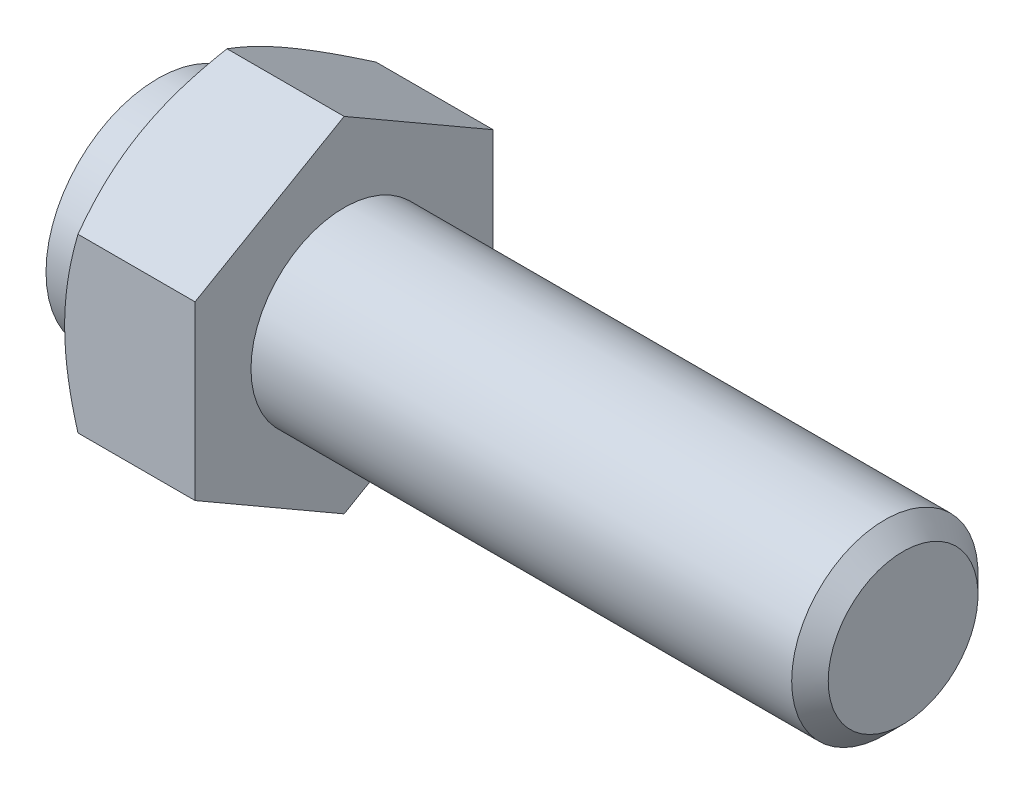
ISO-10303-21;
HEADER;
FILE_DESCRIPTION(('STEP AP214'),'2;1');
FILE_NAME('part.step','',(''),(''),'','','');
FILE_SCHEMA(('AUTOMOTIVE_DESIGN { 1 0 10303 214 1 1 1 1 }'));
ENDSEC;
DATA;
#1=APPLICATION_CONTEXT('core data for automotive mechanical design processes');
#2=APPLICATION_PROTOCOL_DEFINITION('international standard','automotive_design',2000,#1);
#3=PRODUCT_CONTEXT('',#1,'mechanical');
#4=PRODUCT('Part','Part','',(#3));
#5=PRODUCT_RELATED_PRODUCT_CATEGORY('part','',(#4));
#6=PRODUCT_DEFINITION_FORMATION('','',#4);
#7=PRODUCT_DEFINITION_CONTEXT('part definition',#1,'design');
#8=PRODUCT_DEFINITION('design','',#6,#7);
#9=PRODUCT_DEFINITION_SHAPE('','',#8);
#10=(LENGTH_UNIT() NAMED_UNIT(*) SI_UNIT(.MILLI.,.METRE.));
#11=(NAMED_UNIT(*) PLANE_ANGLE_UNIT() SI_UNIT($,.RADIAN.));
#12=(NAMED_UNIT(*) SI_UNIT($,.STERADIAN.) SOLID_ANGLE_UNIT());
#13=UNCERTAINTY_MEASURE_WITH_UNIT(LENGTH_MEASURE(1.E-05),#10,'distance_accuracy_value','');
#14=(GEOMETRIC_REPRESENTATION_CONTEXT(3) GLOBAL_UNCERTAINTY_ASSIGNED_CONTEXT((#13)) GLOBAL_UNIT_ASSIGNED_CONTEXT((#10,
#11,#12)) REPRESENTATION_CONTEXT('',''));
#15=CARTESIAN_POINT('',(0.,0.,0.));
#16=DIRECTION('',(0.,0.,1.));
#17=DIRECTION('',(1.,0.,0.));
#18=AXIS2_PLACEMENT_3D('',#15,#16,#17);
#19=CARTESIAN_POINT('',(-3.0381197846483,0.,0.));
#20=DIRECTION('',(1.,0.,0.));
#21=DIRECTION('',(0.,0.,-1.));
#22=AXIS2_PLACEMENT_3D('',#19,#20,#21);
#23=CONICAL_SURFACE('',#22,4.8,1.0471975511966);
#24=CARTESIAN_POINT('',(-1.57887075856019,-6.13939413294062,-4.));
#25=CARTESIAN_POINT('',(-1.66310456135239,-5.96521405575991,-4.));
#26=CARTESIAN_POINT('',(-1.74651196722151,-5.79062719131365,-4.));
#27=CARTESIAN_POINT('',(-1.91120786296767,-5.4404233088383,-4.));
#28=CARTESIAN_POINT('',(-1.99249600566286,-5.26480612772211,-4.));
#29=CARTESIAN_POINT('',(-2.15291001647984,-4.91138909620253,-4.));
#30=CARTESIAN_POINT('',(-2.23202112648227,-4.73358252336361,-4.));
#31=CARTESIAN_POINT('',(-2.38691919338498,-4.37653257309947,-4.));
#32=CARTESIAN_POINT('',(-2.4627063118463,-4.19728926600801,-4.));
#33=CARTESIAN_POINT('',(-2.61234069122834,-3.83154690304012,-4.));
#34=CARTESIAN_POINT('',(-2.68605704395079,-3.64499398861433,-4.));
#35=CARTESIAN_POINT('',(-2.82775411783598,-3.26968207246464,-4.));
#36=CARTESIAN_POINT('',(-2.89573418644737,-3.08092282252454,-4.));
#37=CARTESIAN_POINT('',(-3.02412704969833,-2.70127250879012,-4.));
#38=CARTESIAN_POINT('',(-3.08455573470301,-2.51038687463865,-4.));
#39=CARTESIAN_POINT('',(-3.19586469424676,-2.12587868357917,-4.));
#40=CARTESIAN_POINT('',(-3.24674804503767,-1.9322570301368,-4.));
#41=CARTESIAN_POINT('',(-3.33621571413744,-1.54322946382705,-4.));
#42=CARTESIAN_POINT('',(-3.37486428853927,-1.34783861004955,-4.));
#43=CARTESIAN_POINT('',(-3.43763422340833,-0.954695670395886,-4.));
#44=CARTESIAN_POINT('',(-3.46175683200502,-0.756943788878232,-4.));
#45=CARTESIAN_POINT('',(-3.49323359916261,-0.362621629692278,-4.));
#46=CARTESIAN_POINT('',(-3.50079822453623,-0.166068575033683,-4.));
#47=CARTESIAN_POINT('',(-3.49906790973023,0.22697710282604,-4.));
#48=CARTESIAN_POINT('',(-3.48977250832793,0.423469724226885,-4.));
#49=CARTESIAN_POINT('',(-3.4601531531514,0.758990273736847,-4.));
#50=CARTESIAN_POINT('',(-3.4437429725596,0.898383211053861,-4.));
#51=CARTESIAN_POINT('',(-3.40349476320339,1.17610009207901,-4.));
#52=CARTESIAN_POINT('',(-3.37965566898105,1.31442387953114,-4.));
#53=CARTESIAN_POINT('',(-3.29825326079294,1.72763495504876,-4.));
#54=CARTESIAN_POINT('',(-3.23082125051095,2.00059716271886,-4.));
#55=CARTESIAN_POINT('',(-3.11451374843233,2.4086618777131,-4.));
#56=CARTESIAN_POINT('',(-3.07269287237421,2.54589494973044,-4.));
#57=CARTESIAN_POINT('',(-2.98486276665558,2.81902707997843,-4.));
#58=CARTESIAN_POINT('',(-2.93885351028713,2.95492612969632,-4.));
#59=CARTESIAN_POINT('',(-2.8433720179148,3.22543632873522,-4.));
#60=CARTESIAN_POINT('',(-2.79390102621892,3.36004792125238,-4.));
#61=CARTESIAN_POINT('',(-2.69206223773492,3.62816633823099,-4.));
#62=CARTESIAN_POINT('',(-2.63969446772329,3.7616731728912,-4.));
#63=CARTESIAN_POINT('',(-2.51762334906241,4.06475987665195,-4.));
#64=CARTESIAN_POINT('',(-2.447153932986,4.23403057744389,-4.));
#65=CARTESIAN_POINT('',(-2.30305911863712,4.57122630399107,-4.));
#66=CARTESIAN_POINT('',(-2.2294335680974,4.73915126435632,-4.));
#67=CARTESIAN_POINT('',(-2.00475288292282,5.24128493973562,-4.));
#68=CARTESIAN_POINT('',(-1.84991548479837,5.57379958004737,-4.));
#69=CARTESIAN_POINT('',(-1.53341711594573,6.23589456855972,-4.));
#70=CARTESIAN_POINT('',(-1.37175021882607,6.56547205474275,-4.));
#71=CARTESIAN_POINT('',(-1.04374298683518,7.22230103495159,-4.));
#72=CARTESIAN_POINT('',(-0.877402497289287,7.54955245154491,-4.));
#73=CARTESIAN_POINT('',(-0.554464691453707,8.17689265348602,-4.));
#74=CARTESIAN_POINT('',(-0.398118172737164,8.47711096920773,-4.));
#75=CARTESIAN_POINT('',(-0.0832622099771653,9.07642118538344,-4.));
#76=CARTESIAN_POINT('',(0.0752472970322463,9.37551305272103,-4.));
#77=CARTESIAN_POINT('',(0.393577197351747,9.97215228024386,-4.));
#78=CARTESIAN_POINT('',(0.553393940840381,10.2697015905905,-4.));
#79=CARTESIAN_POINT('',(0.874341146801538,10.8640723738865,-4.));
#80=CARTESIAN_POINT('',(1.035471544643,11.1608938817197,-4.));
#81=CARTESIAN_POINT('',(1.19709645417552,11.4574439973737,-4.));
#82=B_SPLINE_CURVE_WITH_KNOTS('',3,(#24,#25,#26,#27,#28,#29,#30,#31,#32,#33,#34,#35,#36,#37,#38,
#39,#40,#41,#42,#43,#44,#45,#46,#47,#48,#49,#50,#51,#52,#53,#54,#55,#56,#57,#58,#59,#60,#61,#62,
#63,#64,#65,#66,#67,#68,#69,#70,#71,#72,#73,#74,#75,#76,#77,#78,#79,#80,#81),.UNSPECIFIED.,.F.,
.F.,(4,2,2,2,2,2,2,2,2,2,2,2,2,2,2,2,2,2,2,2,2,2,2,2,2,2,2,2,4),(0.,0.580443710282804,
1.16098191997214,1.74479005581554,2.32856978442474,2.93026499507168,3.5320285616732,
4.13250371575107,4.73278501614091,5.32985927078346,5.92688221507965,6.51627129067315,
7.10567648982992,7.52653774537938,7.94745938882889,8.78979727003888,9.22015473586381,
9.6505149461308,10.0807212518396,10.5109235815821,11.0609419553601,11.610986894627,
12.7112482185919,13.8124847525738,14.9137577755076,15.9292165443316,16.9447049371326,
17.957959920125,18.9711653488122),.UNSPECIFIED.);
#83=CARTESIAN_POINT('',(-3.14273441009184,-2.3094010767585,-4.));
#84=VERTEX_POINT('',#83);
#85=CARTESIAN_POINT('',(-3.5,0.,-4.));
#86=VERTEX_POINT('',#85);
#87=EDGE_CURVE('E203',#84,#86,#82,.T.);
#88=ORIENTED_EDGE('',*,*,#87,.F.);
#89=CARTESIAN_POINT('',(-3.14266774092523,-4.61891762357084,0.000200000000000067));
#90=CARTESIAN_POINT('',(-3.20128212635172,-4.5174314838138,-0.175579150323228));
#91=CARTESIAN_POINT('',(-3.25458967853774,-4.41506932144052,-0.35287561632638));
#92=CARTESIAN_POINT('',(-3.3476383292536,-4.20857250547739,-0.710538593175706));
#93=CARTESIAN_POINT('',(-3.3873465109703,-4.10443418285647,-0.89091145897015));
#94=CARTESIAN_POINT('',(-3.44915778471972,-3.89744813015756,-1.24942181870279));
#95=CARTESIAN_POINT('',(-3.47167226847711,-3.79463224655059,-1.42750415293514));
#96=CARTESIAN_POINT('',(-3.49854937685342,-3.58851671999023,-1.78450671716651));
#97=CARTESIAN_POINT('',(-3.50293425857306,-3.48521782616117,-1.9634256496441));
#98=CARTESIAN_POINT('',(-3.49380992706003,-3.29219970504619,-2.29774284219673));
#99=CARTESIAN_POINT('',(-3.48254104601201,-3.20245157692486,-2.45319115998707));
#100=CARTESIAN_POINT('',(-3.44682600920181,-3.02354002635497,-2.76307505563505));
#101=CARTESIAN_POINT('',(-3.42236765428847,-2.93437722268073,-2.91750956174413));
#102=CARTESIAN_POINT('',(-3.36122393508071,-2.75509682012354,-3.22803232777458));
#103=CARTESIAN_POINT('',(-3.32427939634514,-2.6650019108942,-3.3840812880631));
#104=CARTESIAN_POINT('',(-3.24042992745198,-2.48615580200001,-3.69385183540384));
#105=CARTESIAN_POINT('',(-3.19354469778726,-2.39740231122585,-3.84757739077378));
#106=CARTESIAN_POINT('',(-3.14266774092524,-2.30928560670467,-4.0002));
#107=B_SPLINE_CURVE_WITH_KNOTS('',3,(#89,#90,#91,#92,#93,#94,#95,#96,#97,#98,#99,#100,#101,#102,
#103,#104,#105,#106),.UNSPECIFIED.,.F.,.F.,(4,2,2,2,2,2,2,2,4),(0.,0.634047835695965,
1.26961969224543,1.88946157213122,2.50854226669297,3.04757825393386,3.58711366126903,
4.13861653143764,4.68903648037743),.UNSPECIFIED.);
#108=CARTESIAN_POINT('',(-3.5,-3.46410161513776,-2.));
#109=VERTEX_POINT('',#108);
#110=EDGE_CURVE('E182',#109,#84,#107,.T.);
#111=ORIENTED_EDGE('',*,*,#110,.F.);
#112=CARTESIAN_POINT('',(-3.5,0.,0.));
#113=DIRECTION('',(-1.,0.,0.));
#114=DIRECTION('',(0.,0.,1.));
#115=AXIS2_PLACEMENT_3D('',#112,#113,#114);
#116=CIRCLE('',#115,4.);
#117=EDGE_CURVE('E288',#86,#109,#116,.T.);
#118=ORIENTED_EDGE('',*,*,#117,.F.);
#119=EDGE_LOOP('',(#88,#111,#118));
#120=FACE_BOUND('',#119,.T.);
#121=ADVANCED_FACE('F38',(#120),#23,.T.);
#122=CARTESIAN_POINT('',(-3.14273441009184,2.3094010767585,-4.));
#123=VERTEX_POINT('',#122);
#124=EDGE_CURVE('E189',#86,#123,#82,.T.);
#125=ORIENTED_EDGE('',*,*,#124,.F.);
#126=CARTESIAN_POINT('',(-3.5,3.46410161513776,-2.));
#127=VERTEX_POINT('',#126);
#128=EDGE_CURVE('E287',#127,#86,#116,.T.);
#129=ORIENTED_EDGE('',*,*,#128,.F.);
#130=CARTESIAN_POINT('',(-3.14266774092523,2.30928560670467,-4.0002));
#131=CARTESIAN_POINT('',(-3.20128212635172,2.41077174646171,-3.82442084967677));
#132=CARTESIAN_POINT('',(-3.25458967853774,2.513133908835,-3.64712438367362));
#133=CARTESIAN_POINT('',(-3.3476383292536,2.71963072479812,-3.28946140682429));
#134=CARTESIAN_POINT('',(-3.3873465109703,2.82376904741904,-3.10908854102985));
#135=CARTESIAN_POINT('',(-3.44915778471972,3.03075510011795,-2.75057818129721));
#136=CARTESIAN_POINT('',(-3.47167226847711,3.13357098372492,-2.57249584706486));
#137=CARTESIAN_POINT('',(-3.49854937685342,3.33968651028528,-2.21549328283349));
#138=CARTESIAN_POINT('',(-3.50293425857306,3.44298540411434,-2.0365743503559));
#139=CARTESIAN_POINT('',(-3.49380992706003,3.63600352522932,-1.70225715780327));
#140=CARTESIAN_POINT('',(-3.48254104601201,3.72575165335065,-1.54680884001293));
#141=CARTESIAN_POINT('',(-3.44682600920181,3.90466320392054,-1.23692494436495));
#142=CARTESIAN_POINT('',(-3.42236765428847,3.99382600759478,-1.08249043825587));
#143=CARTESIAN_POINT('',(-3.36122393508071,4.17310641015197,-0.771967672225423));
#144=CARTESIAN_POINT('',(-3.32427939634514,4.26320131938131,-0.615918711936899));
#145=CARTESIAN_POINT('',(-3.24042992745197,4.4420474282755,-0.306148164596161));
#146=CARTESIAN_POINT('',(-3.19354469778726,4.53080091904966,-0.152422609226221));
#147=CARTESIAN_POINT('',(-3.14266774092524,4.61891762357084,0.000199999999999346));
#148=B_SPLINE_CURVE_WITH_KNOTS('',3,(#130,#131,#132,#133,#134,#135,#136,#137,#138,#139,#140,
#141,#142,#143,#144,#145,#146,#147),.UNSPECIFIED.,.F.,.F.,(4,2,2,2,2,2,2,2,4),(0.,
0.634047835695966,1.26961969224543,1.88946157213122,2.50854226669297,3.04757825393386,
3.58711366126903,4.13861653143764,4.68903648037743),.UNSPECIFIED.);
#149=EDGE_CURVE('E202',#123,#127,#148,.T.);
#150=ORIENTED_EDGE('',*,*,#149,.F.);
#151=EDGE_LOOP('',(#125,#129,#150));
#152=FACE_BOUND('',#151,.T.);
#153=ADVANCED_FACE('F171',(#152),#23,.T.);
#154=CARTESIAN_POINT('',(-3.14273441009184,4.61880215351701,0.));
#155=VERTEX_POINT('',#154);
#156=EDGE_CURVE('E196',#127,#155,#148,.T.);
#157=ORIENTED_EDGE('',*,*,#156,.F.);
#158=CARTESIAN_POINT('',(-3.5,3.46410161513776,2.));
#159=VERTEX_POINT('',#158);
#160=EDGE_CURVE('E263',#159,#127,#116,.T.);
#161=ORIENTED_EDGE('',*,*,#160,.F.);
#162=CARTESIAN_POINT('',(-3.14266774092523,4.61891762357084,-0.000200000000000067));
#163=CARTESIAN_POINT('',(-3.20128212635172,4.5174314838138,0.175579150323228));
#164=CARTESIAN_POINT('',(-3.25458967853774,4.41506932144052,0.35287561632638));
#165=CARTESIAN_POINT('',(-3.3476383292536,4.20857250547739,0.710538593175706));
#166=CARTESIAN_POINT('',(-3.3873465109703,4.10443418285647,0.89091145897015));
#167=CARTESIAN_POINT('',(-3.44915778471972,3.89744813015756,1.24942181870279));
#168=CARTESIAN_POINT('',(-3.47167226847711,3.79463224655059,1.42750415293514));
#169=CARTESIAN_POINT('',(-3.49854937685342,3.58851671999023,1.78450671716651));
#170=CARTESIAN_POINT('',(-3.50293425857306,3.48521782616117,1.9634256496441));
#171=CARTESIAN_POINT('',(-3.49380992706003,3.29219970504619,2.29774284219673));
#172=CARTESIAN_POINT('',(-3.48254104601201,3.20245157692486,2.45319115998707));
#173=CARTESIAN_POINT('',(-3.44682600920181,3.02354002635497,2.76307505563505));
#174=CARTESIAN_POINT('',(-3.42236765428847,2.93437722268073,2.91750956174413));
#175=CARTESIAN_POINT('',(-3.36122393508071,2.75509682012354,3.22803232777458));
#176=CARTESIAN_POINT('',(-3.32427939634514,2.6650019108942,3.3840812880631));
#177=CARTESIAN_POINT('',(-3.24042992745198,2.48615580200001,3.69385183540384));
#178=CARTESIAN_POINT('',(-3.19354469778726,2.39740231122585,3.84757739077378));
#179=CARTESIAN_POINT('',(-3.14266774092524,2.30928560670467,4.0002));
#180=B_SPLINE_CURVE_WITH_KNOTS('',3,(#162,#163,#164,#165,#166,#167,#168,#169,#170,#171,#172,
#173,#174,#175,#176,#177,#178,#179),.UNSPECIFIED.,.F.,.F.,(4,2,2,2,2,2,2,2,4),(0.,
0.634047835695965,1.26961969224543,1.88946157213122,2.50854226669297,3.04757825393386,
3.58711366126903,4.13861653143764,4.68903648037743),.UNSPECIFIED.);
#181=EDGE_CURVE('E259',#155,#159,#180,.T.);
#182=ORIENTED_EDGE('',*,*,#181,.F.);
#183=EDGE_LOOP('',(#157,#161,#182));
#184=FACE_BOUND('',#183,.T.);
#185=ADVANCED_FACE('F285',(#184),#23,.T.);
#186=CARTESIAN_POINT('',(-3.14273441009184,-4.61880215351701,0.));
#187=VERTEX_POINT('',#186);
#188=EDGE_CURVE('E295',#187,#109,#107,.T.);
#189=ORIENTED_EDGE('',*,*,#188,.F.);
#190=CARTESIAN_POINT('',(-3.14266774092523,-2.30928560670467,4.0002));
#191=CARTESIAN_POINT('',(-3.20128212635172,-2.41077174646171,3.82442084967677));
#192=CARTESIAN_POINT('',(-3.25458967853774,-2.513133908835,3.64712438367362));
#193=CARTESIAN_POINT('',(-3.3476383292536,-2.71963072479812,3.28946140682429));
#194=CARTESIAN_POINT('',(-3.3873465109703,-2.82376904741904,3.10908854102985));
#195=CARTESIAN_POINT('',(-3.44915778471972,-3.03075510011795,2.75057818129721));
#196=CARTESIAN_POINT('',(-3.47167226847711,-3.13357098372492,2.57249584706486));
#197=CARTESIAN_POINT('',(-3.49854937685342,-3.33968651028528,2.21549328283349));
#198=CARTESIAN_POINT('',(-3.50293425857306,-3.44298540411434,2.0365743503559));
#199=CARTESIAN_POINT('',(-3.49380992706003,-3.63600352522932,1.70225715780327));
#200=CARTESIAN_POINT('',(-3.48254104601201,-3.72575165335065,1.54680884001293));
#201=CARTESIAN_POINT('',(-3.44682600920181,-3.90466320392054,1.23692494436495));
#202=CARTESIAN_POINT('',(-3.42236765428847,-3.99382600759478,1.08249043825587));
#203=CARTESIAN_POINT('',(-3.36122393508071,-4.17310641015197,0.771967672225423));
#204=CARTESIAN_POINT('',(-3.32427939634514,-4.26320131938131,0.615918711936899));
#205=CARTESIAN_POINT('',(-3.24042992745197,-4.4420474282755,0.306148164596161));
#206=CARTESIAN_POINT('',(-3.19354469778726,-4.53080091904966,0.152422609226221));
#207=CARTESIAN_POINT('',(-3.14266774092524,-4.61891762357084,-0.000199999999999346));
#208=B_SPLINE_CURVE_WITH_KNOTS('',3,(#190,#191,#192,#193,#194,#195,#196,#197,#198,#199,#200,
#201,#202,#203,#204,#205,#206,#207),.UNSPECIFIED.,.F.,.F.,(4,2,2,2,2,2,2,2,4),(0.,
0.634047835695966,1.26961969224543,1.88946157213122,2.50854226669297,3.04757825393386,
3.58711366126903,4.13861653143764,4.68903648037743),.UNSPECIFIED.);
#209=CARTESIAN_POINT('',(-3.5,-3.46410161513776,2.));
#210=VERTEX_POINT('',#209);
#211=EDGE_CURVE('E113',#210,#187,#208,.T.);
#212=ORIENTED_EDGE('',*,*,#211,.F.);
#213=EDGE_CURVE('E290',#109,#210,#116,.T.);
#214=ORIENTED_EDGE('',*,*,#213,.F.);
#215=EDGE_LOOP('',(#189,#212,#214));
#216=FACE_BOUND('',#215,.T.);
#217=ADVANCED_FACE('F294',(#216),#23,.T.);
#218=CARTESIAN_POINT('',(-3.14273441009184,2.3094010767585,4.));
#219=VERTEX_POINT('',#218);
#220=EDGE_CURVE('E204',#159,#219,#180,.T.);
#221=ORIENTED_EDGE('',*,*,#220,.F.);
#222=CARTESIAN_POINT('',(-3.5,0.,4.));
#223=VERTEX_POINT('',#222);
#224=EDGE_CURVE('E261',#223,#159,#116,.T.);
#225=ORIENTED_EDGE('',*,*,#224,.F.);
#226=CARTESIAN_POINT('',(-1.57887075856019,-6.13939413294062,4.));
#227=CARTESIAN_POINT('',(-1.66310456135239,-5.96521405575991,4.));
#228=CARTESIAN_POINT('',(-1.74651196722151,-5.79062719131365,4.));
#229=CARTESIAN_POINT('',(-1.91120786296767,-5.4404233088383,4.));
#230=CARTESIAN_POINT('',(-1.99249600566286,-5.26480612772211,4.));
#231=CARTESIAN_POINT('',(-2.15291001647984,-4.91138909620253,4.));
#232=CARTESIAN_POINT('',(-2.23202112648227,-4.73358252336361,4.));
#233=CARTESIAN_POINT('',(-2.38691919338498,-4.37653257309947,4.));
#234=CARTESIAN_POINT('',(-2.4627063118463,-4.19728926600801,4.));
#235=CARTESIAN_POINT('',(-2.61234069122834,-3.83154690304012,4.));
#236=CARTESIAN_POINT('',(-2.68605704395079,-3.64499398861433,4.));
#237=CARTESIAN_POINT('',(-2.82775411783598,-3.26968207246464,4.));
#238=CARTESIAN_POINT('',(-2.89573418644737,-3.08092282252454,4.));
#239=CARTESIAN_POINT('',(-3.02412704969833,-2.70127250879012,4.));
#240=CARTESIAN_POINT('',(-3.08455573470301,-2.51038687463865,4.));
#241=CARTESIAN_POINT('',(-3.19586469424676,-2.12587868357917,4.));
#242=CARTESIAN_POINT('',(-3.24674804503767,-1.9322570301368,4.));
#243=CARTESIAN_POINT('',(-3.33621571413744,-1.54322946382705,4.));
#244=CARTESIAN_POINT('',(-3.37486428853927,-1.34783861004955,4.));
#245=CARTESIAN_POINT('',(-3.43763422340833,-0.954695670395886,4.));
#246=CARTESIAN_POINT('',(-3.46175683200502,-0.756943788878232,4.));
#247=CARTESIAN_POINT('',(-3.49323359916261,-0.362621629692278,4.));
#248=CARTESIAN_POINT('',(-3.50079822453623,-0.166068575033683,4.));
#249=CARTESIAN_POINT('',(-3.49906790973023,0.22697710282604,4.));
#250=CARTESIAN_POINT('',(-3.48977250832793,0.423469724226885,4.));
#251=CARTESIAN_POINT('',(-3.4601531531514,0.758990273736847,4.));
#252=CARTESIAN_POINT('',(-3.4437429725596,0.898383211053861,4.));
#253=CARTESIAN_POINT('',(-3.40349476320339,1.17610009207901,4.));
#254=CARTESIAN_POINT('',(-3.37965566898105,1.31442387953114,4.));
#255=CARTESIAN_POINT('',(-3.29825326079294,1.72763495504876,4.));
#256=CARTESIAN_POINT('',(-3.23082125051095,2.00059716271886,4.));
#257=CARTESIAN_POINT('',(-3.11451374843233,2.4086618777131,4.));
#258=CARTESIAN_POINT('',(-3.07269287237421,2.54589494973044,4.));
#259=CARTESIAN_POINT('',(-2.98486276665558,2.81902707997843,4.));
#260=CARTESIAN_POINT('',(-2.93885351028713,2.95492612969632,4.));
#261=CARTESIAN_POINT('',(-2.8433720179148,3.22543632873522,4.));
#262=CARTESIAN_POINT('',(-2.79390102621892,3.36004792125238,4.));
#263=CARTESIAN_POINT('',(-2.69206223773492,3.62816633823099,4.));
#264=CARTESIAN_POINT('',(-2.63969446772329,3.7616731728912,4.));
#265=CARTESIAN_POINT('',(-2.51762334906241,4.06475987665195,4.));
#266=CARTESIAN_POINT('',(-2.447153932986,4.23403057744389,4.));
#267=CARTESIAN_POINT('',(-2.30305911863712,4.57122630399107,4.));
#268=CARTESIAN_POINT('',(-2.2294335680974,4.73915126435632,4.));
#269=CARTESIAN_POINT('',(-2.00475288292282,5.24128493973562,4.));
#270=CARTESIAN_POINT('',(-1.84991548479837,5.57379958004737,4.));
#271=CARTESIAN_POINT('',(-1.53341711594573,6.23589456855972,4.));
#272=CARTESIAN_POINT('',(-1.37175021882607,6.56547205474275,4.));
#273=CARTESIAN_POINT('',(-1.04374298683518,7.22230103495159,4.));
#274=CARTESIAN_POINT('',(-0.877402497289287,7.54955245154491,4.));
#275=CARTESIAN_POINT('',(-0.554464691453707,8.17689265348602,4.));
#276=CARTESIAN_POINT('',(-0.398118172737164,8.47711096920773,4.));
#277=CARTESIAN_POINT('',(-0.0832622099771653,9.07642118538344,4.));
#278=CARTESIAN_POINT('',(0.0752472970322463,9.37551305272103,4.));
#279=CARTESIAN_POINT('',(0.393577197351747,9.97215228024386,4.));
#280=CARTESIAN_POINT('',(0.553393940840381,10.2697015905905,4.));
#281=CARTESIAN_POINT('',(0.874341146801538,10.8640723738865,4.));
#282=CARTESIAN_POINT('',(1.035471544643,11.1608938817197,4.));
#283=CARTESIAN_POINT('',(1.19709645417552,11.4574439973737,4.));
#284=B_SPLINE_CURVE_WITH_KNOTS('',3,(#226,#227,#228,#229,#230,#231,#232,#233,#234,#235,#236,
#237,#238,#239,#240,#241,#242,#243,#244,#245,#246,#247,#248,#249,#250,#251,#252,#253,#254,#255,
#256,#257,#258,#259,#260,#261,#262,#263,#264,#265,#266,#267,#268,#269,#270,#271,#272,#273,#274,
#275,#276,#277,#278,#279,#280,#281,#282,#283),.UNSPECIFIED.,.F.,.F.,(4,2,2,2,2,2,2,2,2,2,2,2,2,
2,2,2,2,2,2,2,2,2,2,2,2,2,2,2,4),(0.,0.580443710282804,1.16098191997214,1.74479005581554,
2.32856978442474,2.93026499507168,3.5320285616732,4.13250371575107,4.73278501614091,
5.32985927078346,5.92688221507965,6.51627129067315,7.10567648982992,7.52653774537938,
7.94745938882889,8.78979727003888,9.22015473586381,9.6505149461308,10.0807212518396,
10.5109235815821,11.0609419553601,11.610986894627,12.7112482185919,13.8124847525738,
14.9137577755076,15.9292165443316,16.9447049371326,17.957959920125,18.9711653488122),.UNSPECIFIED.);
#285=EDGE_CURVE('E53',#219,#223,#284,.F.);
#286=ORIENTED_EDGE('',*,*,#285,.F.);
#287=EDGE_LOOP('',(#221,#225,#286));
#288=FACE_BOUND('',#287,.T.);
#289=ADVANCED_FACE('F280',(#288),#23,.T.);
#290=CARTESIAN_POINT('',(-3.14273441009184,-2.3094010767585,4.));
#291=VERTEX_POINT('',#290);
#292=EDGE_CURVE('E296',#291,#210,#208,.T.);
#293=ORIENTED_EDGE('',*,*,#292,.F.);
#294=EDGE_CURVE('E145',#223,#291,#284,.F.);
#295=ORIENTED_EDGE('',*,*,#294,.F.);
#296=EDGE_CURVE('E256',#210,#223,#116,.T.);
#297=ORIENTED_EDGE('',*,*,#296,.F.);
#298=EDGE_LOOP('',(#293,#295,#297));
#299=FACE_BOUND('',#298,.T.);
#300=ADVANCED_FACE('F173',(#299),#23,.T.);
#301=CARTESIAN_POINT('',(-5.,0.,0.));
#302=DIRECTION('',(1.,0.,0.));
#303=DIRECTION('',(0.,0.,-1.));
#304=AXIS2_PLACEMENT_3D('',#301,#302,#303);
#305=PLANE('',#304);
#306=CARTESIAN_POINT('',(-5.,0.,0.));
#307=DIRECTION('',(-1.,0.,0.));
#308=DIRECTION('',(0.,0.,1.));
#309=AXIS2_PLACEMENT_3D('',#306,#307,#308);
#310=CIRCLE('',#309,3.);
#311=CARTESIAN_POINT('',(-5.,0.,3.));
#312=VERTEX_POINT('',#311);
#313=EDGE_CURVE('E11',#312,#312,#310,.T.);
#314=ORIENTED_EDGE('',*,*,#313,.T.);
#315=EDGE_LOOP('',(#314));
#316=FACE_BOUND('',#315,.T.);
#317=ADVANCED_FACE('F40',(#316),#305,.F.);
#318=CARTESIAN_POINT('',(15.,0.,0.));
#319=DIRECTION('',(-1.,0.,0.));
#320=DIRECTION('',(0.,0.,1.));
#321=AXIS2_PLACEMENT_3D('',#318,#319,#320);
#322=CYLINDRICAL_SURFACE('',#321,3.);
#323=ORIENTED_EDGE('',*,*,#313,.F.);
#324=EDGE_LOOP('',(#323));
#325=FACE_BOUND('',#324,.T.);
#326=CARTESIAN_POINT('',(-3.5,0.,0.));
#327=DIRECTION('',(-1.,0.,0.));
#328=DIRECTION('',(0.,0.,1.));
#329=AXIS2_PLACEMENT_3D('',#326,#327,#328);
#330=CIRCLE('',#329,3.);
#331=CARTESIAN_POINT('',(-3.5,0.,3.));
#332=VERTEX_POINT('',#331);
#333=EDGE_CURVE('E46',#332,#332,#330,.T.);
#334=ORIENTED_EDGE('',*,*,#333,.T.);
#335=EDGE_LOOP('',(#334));
#336=FACE_BOUND('',#335,.T.);
#337=ADVANCED_FACE('F267',(#325,#336),#322,.T.);
#338=CARTESIAN_POINT('',(-3.5,3.,0.));
#339=DIRECTION('',(1.,0.,0.));
#340=DIRECTION('',(0.,0.,-1.));
#341=AXIS2_PLACEMENT_3D('',#338,#339,#340);
#342=PLANE('',#341);
#343=ORIENTED_EDGE('',*,*,#333,.F.);
#344=EDGE_LOOP('',(#343));
#345=FACE_BOUND('',#344,.T.);
#346=ORIENTED_EDGE('',*,*,#224,.T.);
#347=ORIENTED_EDGE('',*,*,#160,.T.);
#348=ORIENTED_EDGE('',*,*,#128,.T.);
#349=ORIENTED_EDGE('',*,*,#117,.T.);
#350=ORIENTED_EDGE('',*,*,#213,.T.);
#351=ORIENTED_EDGE('',*,*,#296,.T.);
#352=EDGE_LOOP('',(#346,#347,#348,#349,#350,#351));
#353=FACE_BOUND('',#352,.T.);
#354=ADVANCED_FACE('F175',(#345,#353),#342,.F.);
#355=CARTESIAN_POINT('',(-5.,4.61880215351701,0.));
#356=DIRECTION('',(0.,0.866025403784439,0.5));
#357=DIRECTION('',(0.,-0.5,0.866025403784439));
#358=AXIS2_PLACEMENT_3D('',#355,#356,#357);
#359=PLANE('',#358);
#360=ORIENTED_EDGE('',*,*,#181,.T.);
#361=ORIENTED_EDGE('',*,*,#220,.T.);
#362=DIRECTION('',(1.,0.,0.));
#363=VECTOR('',#362,1.);
#364=CARTESIAN_POINT('',(-5.,2.3094010767585,4.));
#365=LINE('',#364,#363);
#366=CARTESIAN_POINT('',(0.,2.3094010767585,4.));
#367=VERTEX_POINT('',#366);
#368=EDGE_CURVE('E142',#219,#367,#365,.T.);
#369=ORIENTED_EDGE('',*,*,#368,.T.);
#370=DIRECTION('',(0.,-0.5,0.866025403784439));
#371=VECTOR('',#370,1.);
#372=CARTESIAN_POINT('',(0.,4.61880215351701,0.));
#373=LINE('',#372,#371);
#374=CARTESIAN_POINT('',(0.,4.61880215351701,0.));
#375=VERTEX_POINT('',#374);
#376=EDGE_CURVE('E134',#375,#367,#373,.T.);
#377=ORIENTED_EDGE('',*,*,#376,.F.);
#378=DIRECTION('',(1.,0.,0.));
#379=VECTOR('',#378,1.);
#380=CARTESIAN_POINT('',(-5.,4.61880215351701,0.));
#381=LINE('',#380,#379);
#382=EDGE_CURVE('E143',#155,#375,#381,.T.);
#383=ORIENTED_EDGE('',*,*,#382,.F.);
#384=EDGE_LOOP('',(#360,#361,#369,#377,#383));
#385=FACE_BOUND('',#384,.T.);
#386=ADVANCED_FACE('F214',(#385),#359,.T.);
#387=CARTESIAN_POINT('',(-5.,2.3094010767585,-4.));
#388=DIRECTION('',(0.,0.866025403784439,-0.5));
#389=DIRECTION('',(0.,0.5,0.866025403784439));
#390=AXIS2_PLACEMENT_3D('',#387,#388,#389);
#391=PLANE('',#390);
#392=ORIENTED_EDGE('',*,*,#149,.T.);
#393=ORIENTED_EDGE('',*,*,#156,.T.);
#394=ORIENTED_EDGE('',*,*,#382,.T.);
#395=DIRECTION('',(0.,0.5,0.866025403784439));
#396=VECTOR('',#395,1.);
#397=CARTESIAN_POINT('',(0.,2.3094010767585,-4.));
#398=LINE('',#397,#396);
#399=CARTESIAN_POINT('',(0.,2.3094010767585,-4.));
#400=VERTEX_POINT('',#399);
#401=EDGE_CURVE('E139',#400,#375,#398,.T.);
#402=ORIENTED_EDGE('',*,*,#401,.F.);
#403=DIRECTION('',(1.,0.,0.));
#404=VECTOR('',#403,1.);
#405=CARTESIAN_POINT('',(-5.,2.3094010767585,-4.));
#406=LINE('',#405,#404);
#407=EDGE_CURVE('E146',#123,#400,#406,.T.);
#408=ORIENTED_EDGE('',*,*,#407,.F.);
#409=EDGE_LOOP('',(#392,#393,#394,#402,#408));
#410=FACE_BOUND('',#409,.T.);
#411=ADVANCED_FACE('F210',(#410),#391,.T.);
#412=CARTESIAN_POINT('',(-5.,-2.3094010767585,-4.));
#413=DIRECTION('',(0.,0.,-1.));
#414=DIRECTION('',(-1.,0.,0.));
#415=AXIS2_PLACEMENT_3D('',#412,#413,#414);
#416=PLANE('',#415);
#417=ORIENTED_EDGE('',*,*,#87,.T.);
#418=ORIENTED_EDGE('',*,*,#124,.T.);
#419=ORIENTED_EDGE('',*,*,#407,.T.);
#420=DIRECTION('',(0.,1.,0.));
#421=VECTOR('',#420,1.);
#422=CARTESIAN_POINT('',(0.,-2.3094010767585,-4.));
#423=LINE('',#422,#421);
#424=CARTESIAN_POINT('',(0.,-2.3094010767585,-4.));
#425=VERTEX_POINT('',#424);
#426=EDGE_CURVE('E126',#425,#400,#423,.T.);
#427=ORIENTED_EDGE('',*,*,#426,.F.);
#428=DIRECTION('',(1.,0.,0.));
#429=VECTOR('',#428,1.);
#430=CARTESIAN_POINT('',(-5.,-2.3094010767585,-4.));
#431=LINE('',#430,#429);
#432=EDGE_CURVE('E116',#84,#425,#431,.T.);
#433=ORIENTED_EDGE('',*,*,#432,.F.);
#434=EDGE_LOOP('',(#417,#418,#419,#427,#433));
#435=FACE_BOUND('',#434,.T.);
#436=ADVANCED_FACE('F213',(#435),#416,.T.);
#437=CARTESIAN_POINT('',(-5.,-4.61880215351701,0.));
#438=DIRECTION('',(0.,-0.866025403784439,-0.5));
#439=DIRECTION('',(0.,0.5,-0.866025403784439));
#440=AXIS2_PLACEMENT_3D('',#437,#438,#439);
#441=PLANE('',#440);
#442=ORIENTED_EDGE('',*,*,#188,.T.);
#443=ORIENTED_EDGE('',*,*,#110,.T.);
#444=ORIENTED_EDGE('',*,*,#432,.T.);
#445=DIRECTION('',(0.,0.5,-0.866025403784439));
#446=VECTOR('',#445,1.);
#447=CARTESIAN_POINT('',(0.,-4.61880215351701,0.));
#448=LINE('',#447,#446);
#449=CARTESIAN_POINT('',(0.,-4.61880215351701,0.));
#450=VERTEX_POINT('',#449);
#451=EDGE_CURVE('E120',#450,#425,#448,.T.);
#452=ORIENTED_EDGE('',*,*,#451,.F.);
#453=DIRECTION('',(1.,0.,0.));
#454=VECTOR('',#453,1.);
#455=CARTESIAN_POINT('',(-5.,-4.61880215351701,0.));
#456=LINE('',#455,#454);
#457=EDGE_CURVE('E109',#187,#450,#456,.T.);
#458=ORIENTED_EDGE('',*,*,#457,.F.);
#459=EDGE_LOOP('',(#442,#443,#444,#452,#458));
#460=FACE_BOUND('',#459,.T.);
#461=ADVANCED_FACE('F121',(#460),#441,.T.);
#462=CARTESIAN_POINT('',(-5.,-2.3094010767585,4.));
#463=DIRECTION('',(0.,-0.866025403784439,0.5));
#464=DIRECTION('',(0.,-0.5,-0.866025403784439));
#465=AXIS2_PLACEMENT_3D('',#462,#463,#464);
#466=PLANE('',#465);
#467=ORIENTED_EDGE('',*,*,#292,.T.);
#468=ORIENTED_EDGE('',*,*,#211,.T.);
#469=ORIENTED_EDGE('',*,*,#457,.T.);
#470=DIRECTION('',(0.,-0.5,-0.866025403784439));
#471=VECTOR('',#470,1.);
#472=CARTESIAN_POINT('',(0.,-2.3094010767585,4.));
#473=LINE('',#472,#471);
#474=CARTESIAN_POINT('',(0.,-2.3094010767585,4.));
#475=VERTEX_POINT('',#474);
#476=EDGE_CURVE('E61',#475,#450,#473,.T.);
#477=ORIENTED_EDGE('',*,*,#476,.F.);
#478=DIRECTION('',(1.,0.,0.));
#479=VECTOR('',#478,1.);
#480=CARTESIAN_POINT('',(-5.,-2.3094010767585,4.));
#481=LINE('',#480,#479);
#482=EDGE_CURVE('E117',#291,#475,#481,.T.);
#483=ORIENTED_EDGE('',*,*,#482,.F.);
#484=EDGE_LOOP('',(#467,#468,#469,#477,#483));
#485=FACE_BOUND('',#484,.T.);
#486=ADVANCED_FACE('F111',(#485),#466,.T.);
#487=CARTESIAN_POINT('',(-5.,2.3094010767585,4.));
#488=DIRECTION('',(0.,0.,1.));
#489=DIRECTION('',(1.,0.,0.));
#490=AXIS2_PLACEMENT_3D('',#487,#488,#489);
#491=PLANE('',#490);
#492=ORIENTED_EDGE('',*,*,#285,.T.);
#493=ORIENTED_EDGE('',*,*,#294,.T.);
#494=ORIENTED_EDGE('',*,*,#482,.T.);
#495=DIRECTION('',(0.,-1.,0.));
#496=VECTOR('',#495,1.);
#497=CARTESIAN_POINT('',(0.,2.3094010767585,4.));
#498=LINE('',#497,#496);
#499=EDGE_CURVE('E132',#367,#475,#498,.T.);
#500=ORIENTED_EDGE('',*,*,#499,.F.);
#501=ORIENTED_EDGE('',*,*,#368,.F.);
#502=EDGE_LOOP('',(#492,#493,#494,#500,#501));
#503=FACE_BOUND('',#502,.T.);
#504=ADVANCED_FACE('F164',(#503),#491,.T.);
#505=CARTESIAN_POINT('',(15.,2.0095,0.));
#506=DIRECTION('',(-1.,0.,0.));
#507=DIRECTION('',(0.,0.,1.));
#508=AXIS2_PLACEMENT_3D('',#505,#506,#507);
#509=PLANE('',#508);
#510=CARTESIAN_POINT('',(15.,0.,0.));
#511=DIRECTION('',(-1.,0.,0.));
#512=DIRECTION('',(0.,0.,1.));
#513=AXIS2_PLACEMENT_3D('',#510,#511,#512);
#514=CIRCLE('',#513,2.0095);
#515=CARTESIAN_POINT('',(15.,0.,2.0095));
#516=VERTEX_POINT('',#515);
#517=EDGE_CURVE('E254',#516,#516,#514,.T.);
#518=ORIENTED_EDGE('',*,*,#517,.F.);
#519=EDGE_LOOP('',(#518));
#520=FACE_BOUND('',#519,.T.);
#521=ADVANCED_FACE('F226',(#520),#509,.F.);
#522=CARTESIAN_POINT('',(15.,0.,0.));
#523=DIRECTION('',(-1.,0.,0.));
#524=DIRECTION('',(0.,0.,1.));
#525=AXIS2_PLACEMENT_3D('',#522,#523,#524);
#526=CONICAL_SURFACE('',#525,2.0095,0.785398163397449);
#527=CARTESIAN_POINT('',(14.5095,0.,0.));
#528=DIRECTION('',(-1.,0.,0.));
#529=DIRECTION('',(0.,0.,1.));
#530=AXIS2_PLACEMENT_3D('',#527,#528,#529);
#531=CIRCLE('',#530,2.5);
#532=CARTESIAN_POINT('',(14.5095,0.,2.5));
#533=VERTEX_POINT('',#532);
#534=EDGE_CURVE('E253',#533,#533,#531,.T.);
#535=ORIENTED_EDGE('',*,*,#534,.F.);
#536=EDGE_LOOP('',(#535));
#537=FACE_BOUND('',#536,.T.);
#538=ORIENTED_EDGE('',*,*,#517,.T.);
#539=EDGE_LOOP('',(#538));
#540=FACE_BOUND('',#539,.T.);
#541=ADVANCED_FACE('F230',(#537,#540),#526,.T.);
#542=CARTESIAN_POINT('',(15.,0.,0.));
#543=DIRECTION('',(-1.,0.,0.));
#544=DIRECTION('',(0.,0.,1.));
#545=AXIS2_PLACEMENT_3D('',#542,#543,#544);
#546=CYLINDRICAL_SURFACE('',#545,2.5);
#547=CARTESIAN_POINT('',(0.,0.,0.));
#548=DIRECTION('',(-1.,0.,0.));
#549=DIRECTION('',(0.,0.,1.));
#550=AXIS2_PLACEMENT_3D('',#547,#548,#549);
#551=CIRCLE('',#550,2.5);
#552=CARTESIAN_POINT('',(0.,0.,2.5));
#553=VERTEX_POINT('',#552);
#554=EDGE_CURVE('E250',#553,#553,#551,.T.);
#555=ORIENTED_EDGE('',*,*,#554,.F.);
#556=EDGE_LOOP('',(#555));
#557=FACE_BOUND('',#556,.T.);
#558=ORIENTED_EDGE('',*,*,#534,.T.);
#559=EDGE_LOOP('',(#558));
#560=FACE_BOUND('',#559,.T.);
#561=ADVANCED_FACE('F236',(#557,#560),#546,.T.);
#562=CARTESIAN_POINT('',(0.,4.8,0.));
#563=DIRECTION('',(-1.,0.,0.));
#564=DIRECTION('',(0.,0.,1.));
#565=AXIS2_PLACEMENT_3D('',#562,#563,#564);
#566=PLANE('',#565);
#567=ORIENTED_EDGE('',*,*,#554,.T.);
#568=EDGE_LOOP('',(#567));
#569=FACE_BOUND('',#568,.T.);
#570=ORIENTED_EDGE('',*,*,#376,.T.);
#571=ORIENTED_EDGE('',*,*,#499,.T.);
#572=ORIENTED_EDGE('',*,*,#476,.T.);
#573=ORIENTED_EDGE('',*,*,#451,.T.);
#574=ORIENTED_EDGE('',*,*,#426,.T.);
#575=ORIENTED_EDGE('',*,*,#401,.T.);
#576=EDGE_LOOP('',(#570,#571,#572,#573,#574,#575));
#577=FACE_BOUND('',#576,.T.);
#578=ADVANCED_FACE('F130',(#569,#577),#566,.F.);
#579=CLOSED_SHELL('',(#121,#153,#185,#217,#289,#300,#317,#337,#354,#386,#411,#436,#461,#486,
#504,#521,#541,#561,#578));
#580=MANIFOLD_SOLID_BREP('B2',#579);
#581=ADVANCED_BREP_SHAPE_REPRESENTATION('',(#18,#580),#14);
#582=SHAPE_DEFINITION_REPRESENTATION(#9,#581);
ENDSEC;
END-ISO-10303-21;
